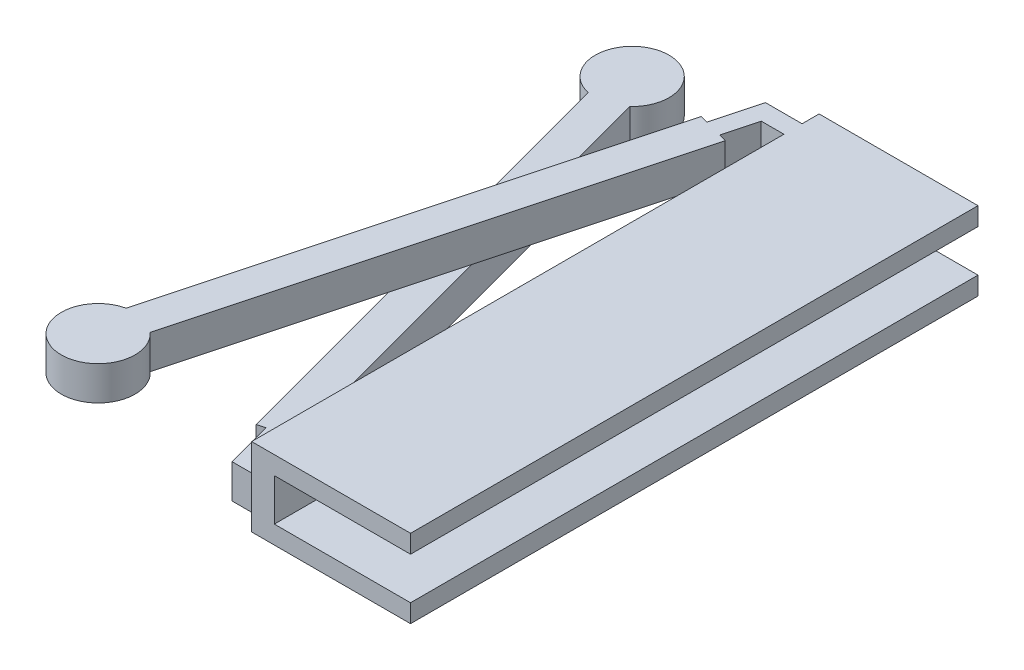
ISO-10303-21;
HEADER;
FILE_DESCRIPTION(('STEP AP214'),'2;1');
FILE_NAME('part.step','',(''),(''),'','','');
FILE_SCHEMA(('AUTOMOTIVE_DESIGN { 1 0 10303 214 1 1 1 1 }'));
ENDSEC;
DATA;
#1=APPLICATION_CONTEXT('core data for automotive mechanical design processes');
#2=APPLICATION_PROTOCOL_DEFINITION('international standard','automotive_design',2000,#1);
#3=PRODUCT_CONTEXT('',#1,'mechanical');
#4=PRODUCT('Part','Part','',(#3));
#5=PRODUCT_RELATED_PRODUCT_CATEGORY('part','',(#4));
#6=PRODUCT_DEFINITION_FORMATION('','',#4);
#7=PRODUCT_DEFINITION_CONTEXT('part definition',#1,'design');
#8=PRODUCT_DEFINITION('design','',#6,#7);
#9=PRODUCT_DEFINITION_SHAPE('','',#8);
#10=(LENGTH_UNIT() NAMED_UNIT(*) SI_UNIT(.MILLI.,.METRE.));
#11=(NAMED_UNIT(*) PLANE_ANGLE_UNIT() SI_UNIT($,.RADIAN.));
#12=(NAMED_UNIT(*) SI_UNIT($,.STERADIAN.) SOLID_ANGLE_UNIT());
#13=UNCERTAINTY_MEASURE_WITH_UNIT(LENGTH_MEASURE(1.E-05),#10,'distance_accuracy_value','');
#14=(GEOMETRIC_REPRESENTATION_CONTEXT(3) GLOBAL_UNCERTAINTY_ASSIGNED_CONTEXT((#13)) GLOBAL_UNIT_ASSIGNED_CONTEXT((#10,
#11,#12)) REPRESENTATION_CONTEXT('',''));
#15=CARTESIAN_POINT('',(0.,0.,0.));
#16=DIRECTION('',(0.,0.,1.));
#17=DIRECTION('',(1.,0.,0.));
#18=AXIS2_PLACEMENT_3D('',#15,#16,#17);
#19=CARTESIAN_POINT('',(0.,0.,50.));
#20=DIRECTION('',(1.,0.,0.));
#21=DIRECTION('',(0.,0.,-1.));
#22=AXIS2_PLACEMENT_3D('',#19,#20,#21);
#23=PLANE('',#22);
#24=DIRECTION('',(0.,0.,-1.));
#25=VECTOR('',#24,1.);
#26=CARTESIAN_POINT('',(0.,3.,50.));
#27=LINE('',#26,#25);
#28=CARTESIAN_POINT('',(0.,3.,48.5));
#29=VERTEX_POINT('',#28);
#30=CARTESIAN_POINT('',(0.,3.,46.9));
#31=VERTEX_POINT('',#30);
#32=EDGE_CURVE('E273',#29,#31,#27,.T.);
#33=ORIENTED_EDGE('',*,*,#32,.F.);
#34=DIRECTION('',(0.,-1.,0.));
#35=VECTOR('',#34,1.);
#36=CARTESIAN_POINT('',(0.,3.,48.5));
#37=LINE('',#36,#35);
#38=CARTESIAN_POINT('',(0.,0.,48.5));
#39=VERTEX_POINT('',#38);
#40=EDGE_CURVE('E319',#29,#39,#37,.T.);
#41=ORIENTED_EDGE('',*,*,#40,.T.);
#42=DIRECTION('',(0.,0.,-1.));
#43=VECTOR('',#42,1.);
#44=CARTESIAN_POINT('',(0.,0.,50.));
#45=LINE('',#44,#43);
#46=CARTESIAN_POINT('',(0.,0.,50.));
#47=VERTEX_POINT('',#46);
#48=EDGE_CURVE('E491',#47,#39,#45,.T.);
#49=ORIENTED_EDGE('',*,*,#48,.F.);
#50=DIRECTION('',(0.,-1.,0.));
#51=VECTOR('',#50,1.);
#52=CARTESIAN_POINT('',(0.,0.,50.));
#53=LINE('',#52,#51);
#54=CARTESIAN_POINT('',(0.,6.90000000000001,50.));
#55=VERTEX_POINT('',#54);
#56=EDGE_CURVE('E462',#55,#47,#53,.T.);
#57=ORIENTED_EDGE('',*,*,#56,.F.);
#58=DIRECTION('',(0.,0.,-1.));
#59=VECTOR('',#58,1.);
#60=CARTESIAN_POINT('',(0.,6.90000000000001,50.));
#61=LINE('',#60,#59);
#62=CARTESIAN_POINT('',(0.,6.90000000000001,3.1));
#63=VERTEX_POINT('',#62);
#64=EDGE_CURVE('E496',#55,#63,#61,.T.);
#65=ORIENTED_EDGE('',*,*,#64,.T.);
#66=DIRECTION('',(0.,1.,0.));
#67=VECTOR('',#66,1.);
#68=CARTESIAN_POINT('',(0.,3.90000000000001,3.1));
#69=LINE('',#68,#67);
#70=CARTESIAN_POINT('',(0.,3.90000000000001,3.1));
#71=VERTEX_POINT('',#70);
#72=EDGE_CURVE('E419',#71,#63,#69,.T.);
#73=ORIENTED_EDGE('',*,*,#72,.F.);
#74=DIRECTION('',(0.,0.,1.));
#75=VECTOR('',#74,1.);
#76=CARTESIAN_POINT('',(0.,3.90000000000001,0.));
#77=LINE('',#76,#75);
#78=CARTESIAN_POINT('',(0.,3.90000000000001,1.5));
#79=VERTEX_POINT('',#78);
#80=EDGE_CURVE('E361',#79,#71,#77,.T.);
#81=ORIENTED_EDGE('',*,*,#80,.F.);
#82=DIRECTION('',(0.,1.,0.));
#83=VECTOR('',#82,1.);
#84=CARTESIAN_POINT('',(0.,3.90000000000001,1.5));
#85=LINE('',#84,#83);
#86=CARTESIAN_POINT('',(0.,6.90000000000001,1.5));
#87=VERTEX_POINT('',#86);
#88=EDGE_CURVE('E416',#79,#87,#85,.T.);
#89=ORIENTED_EDGE('',*,*,#88,.T.);
#90=CARTESIAN_POINT('',(0.,6.90000000000001,0.));
#91=VERTEX_POINT('',#90);
#92=EDGE_CURVE('E495',#87,#91,#61,.T.);
#93=ORIENTED_EDGE('',*,*,#92,.T.);
#94=DIRECTION('',(0.,-1.,0.));
#95=VECTOR('',#94,1.);
#96=CARTESIAN_POINT('',(0.,0.,0.));
#97=LINE('',#96,#95);
#98=CARTESIAN_POINT('',(0.,0.,0.));
#99=VERTEX_POINT('',#98);
#100=EDGE_CURVE('E444',#91,#99,#97,.T.);
#101=ORIENTED_EDGE('',*,*,#100,.T.);
#102=CARTESIAN_POINT('',(0.,0.,46.9));
#103=VERTEX_POINT('',#102);
#104=EDGE_CURVE('E465',#103,#99,#45,.T.);
#105=ORIENTED_EDGE('',*,*,#104,.F.);
#106=DIRECTION('',(0.,-1.,0.));
#107=VECTOR('',#106,1.);
#108=CARTESIAN_POINT('',(0.,3.,46.9));
#109=LINE('',#108,#107);
#110=EDGE_CURVE('E323',#31,#103,#109,.T.);
#111=ORIENTED_EDGE('',*,*,#110,.F.);
#112=EDGE_LOOP('',(#33,#41,#49,#57,#65,#73,#81,#89,#93,#101,#105,#111));
#113=FACE_BOUND('',#112,.T.);
#114=ADVANCED_FACE('F41',(#113),#23,.F.);
#115=CARTESIAN_POINT('',(14.,0.,50.));
#116=DIRECTION('',(0.,1.,0.));
#117=DIRECTION('',(-1.,0.,0.));
#118=AXIS2_PLACEMENT_3D('',#115,#116,#117);
#119=PLANE('',#118);
#120=DIRECTION('',(1.,0.,0.));
#121=VECTOR('',#120,1.);
#122=CARTESIAN_POINT('',(14.,0.,0.));
#123=LINE('',#122,#121);
#124=CARTESIAN_POINT('',(14.,0.,0.));
#125=VERTEX_POINT('',#124);
#126=EDGE_CURVE('E409',#99,#125,#123,.T.);
#127=ORIENTED_EDGE('',*,*,#126,.T.);
#128=DIRECTION('',(0.,0.,-1.));
#129=VECTOR('',#128,1.);
#130=CARTESIAN_POINT('',(14.,0.,50.));
#131=LINE('',#130,#129);
#132=CARTESIAN_POINT('',(14.,0.,50.));
#133=VERTEX_POINT('',#132);
#134=EDGE_CURVE('E11',#133,#125,#131,.T.);
#135=ORIENTED_EDGE('',*,*,#134,.F.);
#136=DIRECTION('',(1.,0.,0.));
#137=VECTOR('',#136,1.);
#138=CARTESIAN_POINT('',(14.,0.,50.));
#139=LINE('',#138,#137);
#140=EDGE_CURVE('E439',#47,#133,#139,.T.);
#141=ORIENTED_EDGE('',*,*,#140,.F.);
#142=ORIENTED_EDGE('',*,*,#48,.T.);
#143=DIRECTION('',(-1.,0.,0.));
#144=VECTOR('',#143,1.);
#145=CARTESIAN_POINT('',(0.,0.,48.5));
#146=LINE('',#145,#144);
#147=CARTESIAN_POINT('',(-3.22772318076634,0.,48.5));
#148=VERTEX_POINT('',#147);
#149=EDGE_CURVE('E303',#39,#148,#146,.T.);
#150=ORIENTED_EDGE('',*,*,#149,.T.);
#151=DIRECTION('',(-0.258819045102517,0.,-0.965925826289069));
#152=VECTOR('',#151,1.);
#153=CARTESIAN_POINT('',(-2.63650672584696,0.,50.7064498480299));
#154=LINE('',#153,#152);
#155=CARTESIAN_POINT('',(-4.32193845737006,0.,44.4163329932968));
#156=VERTEX_POINT('',#155);
#157=EDGE_CURVE('E259',#148,#156,#154,.T.);
#158=ORIENTED_EDGE('',*,*,#157,.T.);
#159=DIRECTION('',(-0.96592582628907,0.,0.258819045102517));
#160=VECTOR('',#159,1.);
#161=CARTESIAN_POINT('',(-1.6854317315231,0.,43.7098831452669));
#162=LINE('',#161,#160);
#163=CARTESIAN_POINT('',(-4.99808653577242,0.,44.5975063248686));
#164=VERTEX_POINT('',#163);
#165=EDGE_CURVE('E255',#156,#164,#162,.T.);
#166=ORIENTED_EDGE('',*,*,#165,.T.);
#167=DIRECTION('',(-0.258819045102517,0.,-0.96592582628907));
#168=VECTOR('',#167,1.);
#169=CARTESIAN_POINT('',(-3.31265480424932,0.,50.8876231796017));
#170=LINE('',#169,#168);
#171=CARTESIAN_POINT('',(-15.7026770298492,0.,4.6474307267546));
#172=VERTEX_POINT('',#171);
#173=EDGE_CURVE('E286',#164,#172,#170,.T.);
#174=ORIENTED_EDGE('',*,*,#173,.T.);
#175=CARTESIAN_POINT('',(-15.,0.,1.47430214572886));
#176=DIRECTION('',(0.,-1.,0.));
#177=DIRECTION('',(-1.,0.,0.));
#178=AXIS2_PLACEMENT_3D('',#175,#176,#177);
#179=CIRCLE('',#178,3.25000000000001);
#180=CARTESIAN_POINT('',(-12.804899550982,0.,3.87097359144704));
#181=VERTEX_POINT('',#180);
#182=EDGE_CURVE('E232',#172,#181,#179,.T.);
#183=ORIENTED_EDGE('',*,*,#182,.T.);
#184=DIRECTION('',(-0.258819045102517,0.,-0.965925826289069));
#185=VECTOR('',#184,1.);
#186=CARTESIAN_POINT('',(-0.414877325382092,0.,50.1111660442941));
#187=LINE('',#186,#185);
#188=CARTESIAN_POINT('',(-2.10030905690519,0.,43.821049189561));
#189=VERTEX_POINT('',#188);
#190=EDGE_CURVE('E291',#189,#181,#187,.T.);
#191=ORIENTED_EDGE('',*,*,#190,.F.);
#192=DIRECTION('',(0.96592582628907,0.,-0.258819045102513));
#193=VECTOR('',#192,1.);
#194=CARTESIAN_POINT('',(-1.68543173152307,0.,43.7098831452669));
#195=LINE('',#194,#193);
#196=CARTESIAN_POINT('',(-2.77645713530754,0.,44.0022225211328));
#197=VERTEX_POINT('',#196);
#198=EDGE_CURVE('E295',#197,#189,#195,.T.);
#199=ORIENTED_EDGE('',*,*,#198,.F.);
#200=DIRECTION('',(-0.258819045102516,0.,-0.96592582628907));
#201=VECTOR('',#200,1.);
#202=CARTESIAN_POINT('',(-1.09102540378445,0.,50.2923393758659));
#203=LINE('',#202,#201);
#204=CARTESIAN_POINT('',(-1.99999999999999,0.,46.9));
#205=VERTEX_POINT('',#204);
#206=EDGE_CURVE('E298',#205,#197,#203,.T.);
#207=ORIENTED_EDGE('',*,*,#206,.F.);
#208=DIRECTION('',(-1.,0.,0.));
#209=VECTOR('',#208,1.);
#210=CARTESIAN_POINT('',(0.,0.,46.9));
#211=LINE('',#210,#209);
#212=EDGE_CURVE('E57',#103,#205,#211,.T.);
#213=ORIENTED_EDGE('',*,*,#212,.F.);
#214=ORIENTED_EDGE('',*,*,#104,.T.);
#215=EDGE_LOOP('',(#127,#135,#141,#142,#150,#158,#166,#174,#183,#191,#199,#207,#213,#214));
#216=FACE_BOUND('',#215,.T.);
#217=ADVANCED_FACE('F43',(#216),#119,.F.);
#218=CARTESIAN_POINT('',(14.,1.6,50.));
#219=DIRECTION('',(-1.,0.,0.));
#220=DIRECTION('',(0.,0.,1.));
#221=AXIS2_PLACEMENT_3D('',#218,#219,#220);
#222=PLANE('',#221);
#223=DIRECTION('',(0.,1.,0.));
#224=VECTOR('',#223,1.);
#225=CARTESIAN_POINT('',(14.,1.6,0.));
#226=LINE('',#225,#224);
#227=CARTESIAN_POINT('',(14.,1.6,0.));
#228=VERTEX_POINT('',#227);
#229=EDGE_CURVE('E469',#125,#228,#226,.T.);
#230=ORIENTED_EDGE('',*,*,#229,.T.);
#231=DIRECTION('',(0.,0.,-1.));
#232=VECTOR('',#231,1.);
#233=CARTESIAN_POINT('',(14.,1.6,50.));
#234=LINE('',#233,#232);
#235=CARTESIAN_POINT('',(14.,1.6,50.));
#236=VERTEX_POINT('',#235);
#237=EDGE_CURVE('E50',#236,#228,#234,.T.);
#238=ORIENTED_EDGE('',*,*,#237,.F.);
#239=DIRECTION('',(0.,1.,0.));
#240=VECTOR('',#239,1.);
#241=CARTESIAN_POINT('',(14.,1.6,50.));
#242=LINE('',#241,#240);
#243=EDGE_CURVE('E443',#133,#236,#242,.T.);
#244=ORIENTED_EDGE('',*,*,#243,.F.);
#245=ORIENTED_EDGE('',*,*,#134,.T.);
#246=EDGE_LOOP('',(#230,#238,#244,#245));
#247=FACE_BOUND('',#246,.T.);
#248=ADVANCED_FACE('F544',(#247),#222,.F.);
#249=CARTESIAN_POINT('',(2.,1.6,50.));
#250=DIRECTION('',(0.,-1.,0.));
#251=DIRECTION('',(0.,0.,-1.));
#252=AXIS2_PLACEMENT_3D('',#249,#250,#251);
#253=PLANE('',#252);
#254=DIRECTION('',(-1.,0.,0.));
#255=VECTOR('',#254,1.);
#256=CARTESIAN_POINT('',(2.,1.6,0.));
#257=LINE('',#256,#255);
#258=CARTESIAN_POINT('',(2.,1.6,0.));
#259=VERTEX_POINT('',#258);
#260=EDGE_CURVE('E472',#228,#259,#257,.T.);
#261=ORIENTED_EDGE('',*,*,#260,.T.);
#262=DIRECTION('',(0.,0.,-1.));
#263=VECTOR('',#262,1.);
#264=CARTESIAN_POINT('',(2.,1.6,50.));
#265=LINE('',#264,#263);
#266=CARTESIAN_POINT('',(2.,1.6,50.));
#267=VERTEX_POINT('',#266);
#268=EDGE_CURVE('E512',#267,#259,#265,.T.);
#269=ORIENTED_EDGE('',*,*,#268,.F.);
#270=DIRECTION('',(-1.,0.,0.));
#271=VECTOR('',#270,1.);
#272=CARTESIAN_POINT('',(2.,1.6,50.));
#273=LINE('',#272,#271);
#274=EDGE_CURVE('E447',#236,#267,#273,.T.);
#275=ORIENTED_EDGE('',*,*,#274,.F.);
#276=ORIENTED_EDGE('',*,*,#237,.T.);
#277=EDGE_LOOP('',(#261,#269,#275,#276));
#278=FACE_BOUND('',#277,.T.);
#279=ADVANCED_FACE('F521',(#278),#253,.F.);
#280=CARTESIAN_POINT('',(2.,5.29999999999999,50.));
#281=DIRECTION('',(-1.,0.,0.));
#282=DIRECTION('',(0.,-1.,0.));
#283=AXIS2_PLACEMENT_3D('',#280,#281,#282);
#284=PLANE('',#283);
#285=DIRECTION('',(0.,1.,0.));
#286=VECTOR('',#285,1.);
#287=CARTESIAN_POINT('',(2.,5.29999999999999,0.));
#288=LINE('',#287,#286);
#289=CARTESIAN_POINT('',(2.,5.29999999999999,0.));
#290=VERTEX_POINT('',#289);
#291=EDGE_CURVE('E475',#259,#290,#288,.T.);
#292=ORIENTED_EDGE('',*,*,#291,.T.);
#293=DIRECTION('',(0.,0.,-1.));
#294=VECTOR('',#293,1.);
#295=CARTESIAN_POINT('',(2.,5.29999999999999,50.));
#296=LINE('',#295,#294);
#297=CARTESIAN_POINT('',(2.,5.29999999999999,50.));
#298=VERTEX_POINT('',#297);
#299=EDGE_CURVE('E508',#298,#290,#296,.T.);
#300=ORIENTED_EDGE('',*,*,#299,.F.);
#301=DIRECTION('',(0.,1.,0.));
#302=VECTOR('',#301,1.);
#303=CARTESIAN_POINT('',(2.,5.29999999999999,50.));
#304=LINE('',#303,#302);
#305=EDGE_CURVE('E450',#267,#298,#304,.T.);
#306=ORIENTED_EDGE('',*,*,#305,.F.);
#307=ORIENTED_EDGE('',*,*,#268,.T.);
#308=EDGE_LOOP('',(#292,#300,#306,#307));
#309=FACE_BOUND('',#308,.T.);
#310=ADVANCED_FACE('F532',(#309),#284,.F.);
#311=CARTESIAN_POINT('',(14.,5.30000000000001,50.));
#312=DIRECTION('',(0.,1.,0.));
#313=DIRECTION('',(-1.,0.,0.));
#314=AXIS2_PLACEMENT_3D('',#311,#312,#313);
#315=PLANE('',#314);
#316=DIRECTION('',(1.,0.,0.));
#317=VECTOR('',#316,1.);
#318=CARTESIAN_POINT('',(14.,5.30000000000001,0.));
#319=LINE('',#318,#317);
#320=CARTESIAN_POINT('',(14.,5.30000000000001,0.));
#321=VERTEX_POINT('',#320);
#322=EDGE_CURVE('E478',#290,#321,#319,.T.);
#323=ORIENTED_EDGE('',*,*,#322,.T.);
#324=DIRECTION('',(0.,0.,-1.));
#325=VECTOR('',#324,1.);
#326=CARTESIAN_POINT('',(14.,5.30000000000001,50.));
#327=LINE('',#326,#325);
#328=CARTESIAN_POINT('',(14.,5.30000000000001,50.));
#329=VERTEX_POINT('',#328);
#330=EDGE_CURVE('E504',#329,#321,#327,.T.);
#331=ORIENTED_EDGE('',*,*,#330,.F.);
#332=DIRECTION('',(1.,0.,0.));
#333=VECTOR('',#332,1.);
#334=CARTESIAN_POINT('',(14.,5.30000000000001,50.));
#335=LINE('',#334,#333);
#336=EDGE_CURVE('E453',#298,#329,#335,.T.);
#337=ORIENTED_EDGE('',*,*,#336,.F.);
#338=ORIENTED_EDGE('',*,*,#299,.T.);
#339=EDGE_LOOP('',(#323,#331,#337,#338));
#340=FACE_BOUND('',#339,.T.);
#341=ADVANCED_FACE('F536',(#340),#315,.F.);
#342=CARTESIAN_POINT('',(14.,6.90000000000001,50.));
#343=DIRECTION('',(-1.,0.,0.));
#344=DIRECTION('',(0.,0.,1.));
#345=AXIS2_PLACEMENT_3D('',#342,#343,#344);
#346=PLANE('',#345);
#347=DIRECTION('',(0.,1.,0.));
#348=VECTOR('',#347,1.);
#349=CARTESIAN_POINT('',(14.,6.90000000000001,0.));
#350=LINE('',#349,#348);
#351=CARTESIAN_POINT('',(14.,6.90000000000001,0.));
#352=VERTEX_POINT('',#351);
#353=EDGE_CURVE('E481',#321,#352,#350,.T.);
#354=ORIENTED_EDGE('',*,*,#353,.T.);
#355=DIRECTION('',(0.,0.,-1.));
#356=VECTOR('',#355,1.);
#357=CARTESIAN_POINT('',(14.,6.90000000000001,50.));
#358=LINE('',#357,#356);
#359=CARTESIAN_POINT('',(14.,6.90000000000001,50.));
#360=VERTEX_POINT('',#359);
#361=EDGE_CURVE('E500',#360,#352,#358,.T.);
#362=ORIENTED_EDGE('',*,*,#361,.F.);
#363=DIRECTION('',(0.,1.,0.));
#364=VECTOR('',#363,1.);
#365=CARTESIAN_POINT('',(14.,6.90000000000001,50.));
#366=LINE('',#365,#364);
#367=EDGE_CURVE('E456',#329,#360,#366,.T.);
#368=ORIENTED_EDGE('',*,*,#367,.F.);
#369=ORIENTED_EDGE('',*,*,#330,.T.);
#370=EDGE_LOOP('',(#354,#362,#368,#369));
#371=FACE_BOUND('',#370,.T.);
#372=ADVANCED_FACE('F559',(#371),#346,.F.);
#373=CARTESIAN_POINT('',(0.,6.90000000000001,50.));
#374=DIRECTION('',(0.,-1.,0.));
#375=DIRECTION('',(0.,0.,-1.));
#376=AXIS2_PLACEMENT_3D('',#373,#374,#375);
#377=PLANE('',#376);
#378=DIRECTION('',(-1.,0.,0.));
#379=VECTOR('',#378,1.);
#380=CARTESIAN_POINT('',(0.,6.90000000000001,0.));
#381=LINE('',#380,#379);
#382=EDGE_CURVE('E484',#352,#91,#381,.T.);
#383=ORIENTED_EDGE('',*,*,#382,.T.);
#384=ORIENTED_EDGE('',*,*,#92,.F.);
#385=DIRECTION('',(-1.,0.,0.));
#386=VECTOR('',#385,1.);
#387=CARTESIAN_POINT('',(0.,6.90000000000001,1.5));
#388=LINE('',#387,#386);
#389=CARTESIAN_POINT('',(-3.22772318076634,6.9,1.5));
#390=VERTEX_POINT('',#389);
#391=EDGE_CURVE('E65',#87,#390,#388,.T.);
#392=ORIENTED_EDGE('',*,*,#391,.T.);
#393=DIRECTION('',(-0.258819045102517,0.,0.965925826289069));
#394=VECTOR('',#393,1.);
#395=CARTESIAN_POINT('',(-2.63650672584696,6.9,-0.706449848029905));
#396=LINE('',#395,#394);
#397=CARTESIAN_POINT('',(-4.32193845737006,6.9,5.58366700670318));
#398=VERTEX_POINT('',#397);
#399=EDGE_CURVE('E399',#390,#398,#396,.T.);
#400=ORIENTED_EDGE('',*,*,#399,.T.);
#401=DIRECTION('',(-0.96592582628907,0.,-0.258819045102517));
#402=VECTOR('',#401,1.);
#403=CARTESIAN_POINT('',(-1.6854317315231,6.9,6.29011685473309));
#404=LINE('',#403,#402);
#405=CARTESIAN_POINT('',(-4.99808653577242,6.9,5.40249367513142));
#406=VERTEX_POINT('',#405);
#407=EDGE_CURVE('E345',#398,#406,#404,.T.);
#408=ORIENTED_EDGE('',*,*,#407,.T.);
#409=DIRECTION('',(-0.258819045102517,0.,0.96592582628907));
#410=VECTOR('',#409,1.);
#411=CARTESIAN_POINT('',(-3.31265480424933,6.9,-0.887623179601669));
#412=LINE('',#411,#410);
#413=CARTESIAN_POINT('',(-15.7026770298492,6.9,45.3525692732454));
#414=VERTEX_POINT('',#413);
#415=EDGE_CURVE('E312',#406,#414,#412,.T.);
#416=ORIENTED_EDGE('',*,*,#415,.T.);
#417=CARTESIAN_POINT('',(-15.,6.9,48.5256978542711));
#418=DIRECTION('',(0.,1.,0.));
#419=DIRECTION('',(-1.,0.,0.));
#420=AXIS2_PLACEMENT_3D('',#417,#418,#419);
#421=CIRCLE('',#420,3.25000000000001);
#422=CARTESIAN_POINT('',(-12.804899550982,6.9,46.129026408553));
#423=VERTEX_POINT('',#422);
#424=EDGE_CURVE('E380',#414,#423,#421,.T.);
#425=ORIENTED_EDGE('',*,*,#424,.T.);
#426=DIRECTION('',(-0.258819045102517,0.,0.965925826289069));
#427=VECTOR('',#426,1.);
#428=CARTESIAN_POINT('',(-0.414877325382095,6.90000000000001,-0.111166044294113));
#429=LINE('',#428,#427);
#430=CARTESIAN_POINT('',(-2.10030905690519,6.9,6.17895081043897));
#431=VERTEX_POINT('',#430);
#432=EDGE_CURVE('E384',#431,#423,#429,.T.);
#433=ORIENTED_EDGE('',*,*,#432,.F.);
#434=DIRECTION('',(0.96592582628907,0.,0.258819045102513));
#435=VECTOR('',#434,1.);
#436=CARTESIAN_POINT('',(-1.68543173152308,6.9,6.29011685473309));
#437=LINE('',#436,#435);
#438=CARTESIAN_POINT('',(-2.77645713530754,6.9,5.99777747886721));
#439=VERTEX_POINT('',#438);
#440=EDGE_CURVE('E388',#439,#431,#437,.T.);
#441=ORIENTED_EDGE('',*,*,#440,.F.);
#442=DIRECTION('',(-0.258819045102516,0.,0.96592582628907));
#443=VECTOR('',#442,1.);
#444=CARTESIAN_POINT('',(-1.09102540378445,6.9,-0.292339375865877));
#445=LINE('',#444,#443);
#446=CARTESIAN_POINT('',(-2.,6.9,3.1));
#447=VERTEX_POINT('',#446);
#448=EDGE_CURVE('E391',#447,#439,#445,.T.);
#449=ORIENTED_EDGE('',*,*,#448,.F.);
#450=DIRECTION('',(-1.,0.,0.));
#451=VECTOR('',#450,1.);
#452=CARTESIAN_POINT('',(0.,6.90000000000001,3.1));
#453=LINE('',#452,#451);
#454=EDGE_CURVE('E394',#63,#447,#453,.T.);
#455=ORIENTED_EDGE('',*,*,#454,.F.);
#456=ORIENTED_EDGE('',*,*,#64,.F.);
#457=DIRECTION('',(-1.,0.,0.));
#458=VECTOR('',#457,1.);
#459=CARTESIAN_POINT('',(0.,6.90000000000001,50.));
#460=LINE('',#459,#458);
#461=EDGE_CURVE('E459',#360,#55,#460,.T.);
#462=ORIENTED_EDGE('',*,*,#461,.F.);
#463=ORIENTED_EDGE('',*,*,#361,.T.);
#464=EDGE_LOOP('',(#383,#384,#392,#400,#408,#416,#425,#433,#441,#449,#455,#456,#462,#463));
#465=FACE_BOUND('',#464,.T.);
#466=ADVANCED_FACE('F555',(#465),#377,.F.);
#467=CARTESIAN_POINT('',(0.,0.,50.));
#468=DIRECTION('',(0.,0.,-1.));
#469=DIRECTION('',(-1.,0.,0.));
#470=AXIS2_PLACEMENT_3D('',#467,#468,#469);
#471=PLANE('',#470);
#472=ORIENTED_EDGE('',*,*,#140,.T.);
#473=ORIENTED_EDGE('',*,*,#243,.T.);
#474=ORIENTED_EDGE('',*,*,#274,.T.);
#475=ORIENTED_EDGE('',*,*,#305,.T.);
#476=ORIENTED_EDGE('',*,*,#336,.T.);
#477=ORIENTED_EDGE('',*,*,#367,.T.);
#478=ORIENTED_EDGE('',*,*,#461,.T.);
#479=ORIENTED_EDGE('',*,*,#56,.T.);
#480=EDGE_LOOP('',(#472,#473,#474,#475,#476,#477,#478,#479));
#481=FACE_BOUND('',#480,.T.);
#482=ADVANCED_FACE('F540',(#481),#471,.F.);
#483=CARTESIAN_POINT('',(0.,0.,0.));
#484=DIRECTION('',(0.,0.,-1.));
#485=DIRECTION('',(-1.,0.,0.));
#486=AXIS2_PLACEMENT_3D('',#483,#484,#485);
#487=PLANE('',#486);
#488=ORIENTED_EDGE('',*,*,#126,.F.);
#489=ORIENTED_EDGE('',*,*,#100,.F.);
#490=ORIENTED_EDGE('',*,*,#382,.F.);
#491=ORIENTED_EDGE('',*,*,#353,.F.);
#492=ORIENTED_EDGE('',*,*,#322,.F.);
#493=ORIENTED_EDGE('',*,*,#291,.F.);
#494=ORIENTED_EDGE('',*,*,#260,.F.);
#495=ORIENTED_EDGE('',*,*,#229,.F.);
#496=EDGE_LOOP('',(#488,#489,#490,#491,#492,#493,#494,#495));
#497=FACE_BOUND('',#496,.T.);
#498=ADVANCED_FACE('F527',(#497),#487,.T.);
#499=CARTESIAN_POINT('',(-3.31265480424932,3.9,-0.887623179601669));
#500=DIRECTION('',(-0.965925826289069,0.,-0.258819045102517));
#501=DIRECTION('',(-0.258819045102517,0.,0.96592582628907));
#502=AXIS2_PLACEMENT_3D('',#499,#500,#501);
#503=PLANE('',#502);
#504=ORIENTED_EDGE('',*,*,#415,.F.);
#505=DIRECTION('',(0.,1.,0.));
#506=VECTOR('',#505,1.);
#507=CARTESIAN_POINT('',(-4.99808653577242,3.9,5.40249367513142));
#508=LINE('',#507,#506);
#509=CARTESIAN_POINT('',(-4.99808653577242,3.9,5.40249367513142));
#510=VERTEX_POINT('',#509);
#511=EDGE_CURVE('E406',#510,#406,#508,.T.);
#512=ORIENTED_EDGE('',*,*,#511,.F.);
#513=DIRECTION('',(-0.258819045102517,0.,0.96592582628907));
#514=VECTOR('',#513,1.);
#515=CARTESIAN_POINT('',(-3.31265480424932,3.9,-0.887623179601669));
#516=LINE('',#515,#514);
#517=CARTESIAN_POINT('',(-15.7026770298492,3.9,45.3525692732454));
#518=VERTEX_POINT('',#517);
#519=EDGE_CURVE('E340',#510,#518,#516,.T.);
#520=ORIENTED_EDGE('',*,*,#519,.T.);
#521=DIRECTION('',(0.,1.,0.));
#522=VECTOR('',#521,1.);
#523=CARTESIAN_POINT('',(-15.7026770298492,3.9,45.3525692732454));
#524=LINE('',#523,#522);
#525=EDGE_CURVE('E376',#518,#414,#524,.T.);
#526=ORIENTED_EDGE('',*,*,#525,.T.);
#527=EDGE_LOOP('',(#504,#512,#520,#526));
#528=FACE_BOUND('',#527,.T.);
#529=ADVANCED_FACE('F576',(#528),#503,.T.);
#530=CARTESIAN_POINT('',(-1.6854317315231,3.90000000000001,6.29011685473309));
#531=DIRECTION('',(0.258819045102517,0.,-0.965925826289069));
#532=DIRECTION('',(-0.96592582628907,0.,-0.258819045102517));
#533=AXIS2_PLACEMENT_3D('',#530,#531,#532);
#534=PLANE('',#533);
#535=ORIENTED_EDGE('',*,*,#407,.F.);
#536=DIRECTION('',(0.,1.,0.));
#537=VECTOR('',#536,1.);
#538=CARTESIAN_POINT('',(-4.32193845737006,3.9,5.58366700670318));
#539=LINE('',#538,#537);
#540=CARTESIAN_POINT('',(-4.32193845737006,3.9,5.58366700670318));
#541=VERTEX_POINT('',#540);
#542=EDGE_CURVE('E410',#541,#398,#539,.T.);
#543=ORIENTED_EDGE('',*,*,#542,.F.);
#544=DIRECTION('',(-0.96592582628907,0.,-0.258819045102517));
#545=VECTOR('',#544,1.);
#546=CARTESIAN_POINT('',(-1.6854317315231,3.90000000000001,6.29011685473309));
#547=LINE('',#546,#545);
#548=EDGE_CURVE('E372',#541,#510,#547,.T.);
#549=ORIENTED_EDGE('',*,*,#548,.T.);
#550=ORIENTED_EDGE('',*,*,#511,.T.);
#551=EDGE_LOOP('',(#535,#543,#549,#550));
#552=FACE_BOUND('',#551,.T.);
#553=ADVANCED_FACE('F581',(#552),#534,.T.);
#554=CARTESIAN_POINT('',(-2.63650672584696,3.9,-0.706449848029905));
#555=DIRECTION('',(-0.965925826289069,0.,-0.258819045102517));
#556=DIRECTION('',(-0.258819045102517,0.,0.965925826289069));
#557=AXIS2_PLACEMENT_3D('',#554,#555,#556);
#558=PLANE('',#557);
#559=ORIENTED_EDGE('',*,*,#399,.F.);
#560=DIRECTION('',(0.,1.,0.));
#561=VECTOR('',#560,1.);
#562=CARTESIAN_POINT('',(-3.22772318076634,3.9,1.5));
#563=LINE('',#562,#561);
#564=CARTESIAN_POINT('',(-3.22772318076634,3.9,1.5));
#565=VERTEX_POINT('',#564);
#566=EDGE_CURVE('E413',#565,#390,#563,.T.);
#567=ORIENTED_EDGE('',*,*,#566,.F.);
#568=DIRECTION('',(-0.258819045102517,0.,0.965925826289069));
#569=VECTOR('',#568,1.);
#570=CARTESIAN_POINT('',(-2.63650672584696,3.9,-0.706449848029905));
#571=LINE('',#570,#569);
#572=EDGE_CURVE('E368',#565,#541,#571,.T.);
#573=ORIENTED_EDGE('',*,*,#572,.T.);
#574=ORIENTED_EDGE('',*,*,#542,.T.);
#575=EDGE_LOOP('',(#559,#567,#573,#574));
#576=FACE_BOUND('',#575,.T.);
#577=ADVANCED_FACE('F607',(#576),#558,.T.);
#578=CARTESIAN_POINT('',(0.,3.90000000000001,1.5));
#579=DIRECTION('',(0.,0.,-1.));
#580=DIRECTION('',(-1.,0.,0.));
#581=AXIS2_PLACEMENT_3D('',#578,#579,#580);
#582=PLANE('',#581);
#583=ORIENTED_EDGE('',*,*,#391,.F.);
#584=ORIENTED_EDGE('',*,*,#88,.F.);
#585=DIRECTION('',(-1.,0.,0.));
#586=VECTOR('',#585,1.);
#587=CARTESIAN_POINT('',(0.,3.90000000000001,1.5));
#588=LINE('',#587,#586);
#589=EDGE_CURVE('E364',#79,#565,#588,.T.);
#590=ORIENTED_EDGE('',*,*,#589,.T.);
#591=ORIENTED_EDGE('',*,*,#566,.T.);
#592=EDGE_LOOP('',(#583,#584,#590,#591));
#593=FACE_BOUND('',#592,.T.);
#594=ADVANCED_FACE('F603',(#593),#582,.T.);
#595=CARTESIAN_POINT('',(0.,3.90000000000001,3.1));
#596=DIRECTION('',(0.,0.,-1.));
#597=DIRECTION('',(-1.,0.,0.));
#598=AXIS2_PLACEMENT_3D('',#595,#596,#597);
#599=PLANE('',#598);
#600=ORIENTED_EDGE('',*,*,#454,.T.);
#601=DIRECTION('',(0.,1.,0.));
#602=VECTOR('',#601,1.);
#603=CARTESIAN_POINT('',(-1.99999999999999,3.90000000000001,3.1));
#604=LINE('',#603,#602);
#605=CARTESIAN_POINT('',(-1.99999999999999,3.90000000000001,3.1));
#606=VERTEX_POINT('',#605);
#607=EDGE_CURVE('E422',#606,#447,#604,.T.);
#608=ORIENTED_EDGE('',*,*,#607,.F.);
#609=DIRECTION('',(-1.,0.,0.));
#610=VECTOR('',#609,1.);
#611=CARTESIAN_POINT('',(0.,3.90000000000001,3.1));
#612=LINE('',#611,#610);
#613=EDGE_CURVE('E358',#71,#606,#612,.T.);
#614=ORIENTED_EDGE('',*,*,#613,.F.);
#615=ORIENTED_EDGE('',*,*,#72,.T.);
#616=EDGE_LOOP('',(#600,#608,#614,#615));
#617=FACE_BOUND('',#616,.T.);
#618=ADVANCED_FACE('F599',(#617),#599,.F.);
#619=CARTESIAN_POINT('',(-1.09102540378445,3.90000000000001,-0.292339375865877));
#620=DIRECTION('',(-0.965925826289069,0.,-0.258819045102516));
#621=DIRECTION('',(-0.258819045102516,0.,0.96592582628907));
#622=AXIS2_PLACEMENT_3D('',#619,#620,#621);
#623=PLANE('',#622);
#624=ORIENTED_EDGE('',*,*,#448,.T.);
#625=DIRECTION('',(0.,1.,0.));
#626=VECTOR('',#625,1.);
#627=CARTESIAN_POINT('',(-2.77645713530754,3.9,5.99777747886721));
#628=LINE('',#627,#626);
#629=CARTESIAN_POINT('',(-2.77645713530754,3.9,5.99777747886721));
#630=VERTEX_POINT('',#629);
#631=EDGE_CURVE('E426',#630,#439,#628,.T.);
#632=ORIENTED_EDGE('',*,*,#631,.F.);
#633=DIRECTION('',(-0.258819045102516,0.,0.96592582628907));
#634=VECTOR('',#633,1.);
#635=CARTESIAN_POINT('',(-1.09102540378445,3.90000000000001,-0.292339375865877));
#636=LINE('',#635,#634);
#637=EDGE_CURVE('E355',#606,#630,#636,.T.);
#638=ORIENTED_EDGE('',*,*,#637,.F.);
#639=ORIENTED_EDGE('',*,*,#607,.T.);
#640=EDGE_LOOP('',(#624,#632,#638,#639));
#641=FACE_BOUND('',#640,.T.);
#642=ADVANCED_FACE('F595',(#641),#623,.F.);
#643=CARTESIAN_POINT('',(-1.68543173152307,3.90000000000001,6.29011685473309));
#644=DIRECTION('',(-0.258819045102513,0.,0.96592582628907));
#645=DIRECTION('',(0.96592582628907,0.,0.258819045102513));
#646=AXIS2_PLACEMENT_3D('',#643,#644,#645);
#647=PLANE('',#646);
#648=ORIENTED_EDGE('',*,*,#440,.T.);
#649=DIRECTION('',(0.,1.,0.));
#650=VECTOR('',#649,1.);
#651=CARTESIAN_POINT('',(-2.10030905690519,3.90000000000001,6.17895081043897));
#652=LINE('',#651,#650);
#653=CARTESIAN_POINT('',(-2.10030905690519,3.90000000000001,6.17895081043897));
#654=VERTEX_POINT('',#653);
#655=EDGE_CURVE('E430',#654,#431,#652,.T.);
#656=ORIENTED_EDGE('',*,*,#655,.F.);
#657=DIRECTION('',(0.96592582628907,0.,0.258819045102513));
#658=VECTOR('',#657,1.);
#659=CARTESIAN_POINT('',(-1.68543173152307,3.90000000000001,6.29011685473309));
#660=LINE('',#659,#658);
#661=EDGE_CURVE('E352',#630,#654,#660,.T.);
#662=ORIENTED_EDGE('',*,*,#661,.F.);
#663=ORIENTED_EDGE('',*,*,#631,.T.);
#664=EDGE_LOOP('',(#648,#656,#662,#663));
#665=FACE_BOUND('',#664,.T.);
#666=ADVANCED_FACE('F591',(#665),#647,.F.);
#667=CARTESIAN_POINT('',(-0.414877325382093,3.90000000000001,-0.111166044294113));
#668=DIRECTION('',(-0.965925826289069,0.,-0.258819045102517));
#669=DIRECTION('',(-0.258819045102517,0.,0.965925826289069));
#670=AXIS2_PLACEMENT_3D('',#667,#668,#669);
#671=PLANE('',#670);
#672=ORIENTED_EDGE('',*,*,#432,.T.);
#673=DIRECTION('',(0.,1.,0.));
#674=VECTOR('',#673,1.);
#675=CARTESIAN_POINT('',(-12.804899550982,3.9,46.129026408553));
#676=LINE('',#675,#674);
#677=CARTESIAN_POINT('',(-12.804899550982,3.9,46.129026408553));
#678=VERTEX_POINT('',#677);
#679=EDGE_CURVE('E434',#678,#423,#676,.T.);
#680=ORIENTED_EDGE('',*,*,#679,.F.);
#681=DIRECTION('',(-0.258819045102517,0.,0.965925826289069));
#682=VECTOR('',#681,1.);
#683=CARTESIAN_POINT('',(-0.414877325382093,3.90000000000001,-0.111166044294113));
#684=LINE('',#683,#682);
#685=EDGE_CURVE('E349',#654,#678,#684,.T.);
#686=ORIENTED_EDGE('',*,*,#685,.F.);
#687=ORIENTED_EDGE('',*,*,#655,.T.);
#688=EDGE_LOOP('',(#672,#680,#686,#687));
#689=FACE_BOUND('',#688,.T.);
#690=ADVANCED_FACE('F587',(#689),#671,.F.);
#691=CARTESIAN_POINT('',(-15.,3.9,48.5256978542711));
#692=DIRECTION('',(0.,1.,0.));
#693=DIRECTION('',(-1.,0.,0.));
#694=AXIS2_PLACEMENT_3D('',#691,#692,#693);
#695=CYLINDRICAL_SURFACE('',#694,3.25000000000001);
#696=ORIENTED_EDGE('',*,*,#424,.F.);
#697=ORIENTED_EDGE('',*,*,#525,.F.);
#698=CARTESIAN_POINT('',(-15.,3.9,48.5256978542711));
#699=DIRECTION('',(0.,1.,0.));
#700=DIRECTION('',(-1.,0.,0.));
#701=AXIS2_PLACEMENT_3D('',#698,#699,#700);
#702=CIRCLE('',#701,3.25000000000001);
#703=EDGE_CURVE('E344',#518,#678,#702,.T.);
#704=ORIENTED_EDGE('',*,*,#703,.T.);
#705=ORIENTED_EDGE('',*,*,#679,.T.);
#706=EDGE_LOOP('',(#696,#697,#704,#705));
#707=FACE_BOUND('',#706,.T.);
#708=ADVANCED_FACE('F583',(#707),#695,.T.);
#709=CARTESIAN_POINT('',(0.,3.90000000000001,0.));
#710=DIRECTION('',(0.,1.,0.));
#711=DIRECTION('',(-1.,0.,0.));
#712=AXIS2_PLACEMENT_3D('',#709,#710,#711);
#713=PLANE('',#712);
#714=ORIENTED_EDGE('',*,*,#519,.F.);
#715=ORIENTED_EDGE('',*,*,#548,.F.);
#716=ORIENTED_EDGE('',*,*,#572,.F.);
#717=ORIENTED_EDGE('',*,*,#589,.F.);
#718=ORIENTED_EDGE('',*,*,#80,.T.);
#719=ORIENTED_EDGE('',*,*,#613,.T.);
#720=ORIENTED_EDGE('',*,*,#637,.T.);
#721=ORIENTED_EDGE('',*,*,#661,.T.);
#722=ORIENTED_EDGE('',*,*,#685,.T.);
#723=ORIENTED_EDGE('',*,*,#703,.F.);
#724=EDGE_LOOP('',(#714,#715,#716,#717,#718,#719,#720,#721,#722,#723));
#725=FACE_BOUND('',#724,.T.);
#726=ADVANCED_FACE('F586',(#725),#713,.F.);
#727=CARTESIAN_POINT('',(-3.31265480424932,3.,50.8876231796017));
#728=DIRECTION('',(-0.965925826289069,0.,0.258819045102517));
#729=DIRECTION('',(0.258819045102517,0.,0.96592582628907));
#730=AXIS2_PLACEMENT_3D('',#727,#728,#729);
#731=PLANE('',#730);
#732=ORIENTED_EDGE('',*,*,#173,.F.);
#733=DIRECTION('',(0.,-1.,0.));
#734=VECTOR('',#733,1.);
#735=CARTESIAN_POINT('',(-4.99808653577242,3.,44.5975063248686));
#736=LINE('',#735,#734);
#737=CARTESIAN_POINT('',(-4.99808653577242,3.,44.5975063248686));
#738=VERTEX_POINT('',#737);
#739=EDGE_CURVE('E253',#738,#164,#736,.T.);
#740=ORIENTED_EDGE('',*,*,#739,.F.);
#741=DIRECTION('',(-0.258819045102517,0.,-0.96592582628907));
#742=VECTOR('',#741,1.);
#743=CARTESIAN_POINT('',(-3.31265480424932,3.,50.8876231796017));
#744=LINE('',#743,#742);
#745=CARTESIAN_POINT('',(-15.7026770298492,3.,4.6474307267546));
#746=VERTEX_POINT('',#745);
#747=EDGE_CURVE('E245',#738,#746,#744,.T.);
#748=ORIENTED_EDGE('',*,*,#747,.T.);
#749=DIRECTION('',(0.,-1.,0.));
#750=VECTOR('',#749,1.);
#751=CARTESIAN_POINT('',(-15.7026770298492,3.,4.6474307267546));
#752=LINE('',#751,#750);
#753=EDGE_CURVE('E227',#746,#172,#752,.T.);
#754=ORIENTED_EDGE('',*,*,#753,.T.);
#755=EDGE_LOOP('',(#732,#740,#748,#754));
#756=FACE_BOUND('',#755,.T.);
#757=ADVANCED_FACE('F252',(#756),#731,.T.);
#758=CARTESIAN_POINT('',(-1.6854317315231,3.,43.7098831452669));
#759=DIRECTION('',(0.258819045102517,0.,0.965925826289069));
#760=DIRECTION('',(0.96592582628907,0.,-0.258819045102517));
#761=AXIS2_PLACEMENT_3D('',#758,#759,#760);
#762=PLANE('',#761);
#763=ORIENTED_EDGE('',*,*,#165,.F.);
#764=DIRECTION('',(0.,-1.,0.));
#765=VECTOR('',#764,1.);
#766=CARTESIAN_POINT('',(-4.32193845737006,3.,44.4163329932968));
#767=LINE('',#766,#765);
#768=CARTESIAN_POINT('',(-4.32193845737006,3.,44.4163329932968));
#769=VERTEX_POINT('',#768);
#770=EDGE_CURVE('E313',#769,#156,#767,.T.);
#771=ORIENTED_EDGE('',*,*,#770,.F.);
#772=DIRECTION('',(-0.96592582628907,0.,0.258819045102517));
#773=VECTOR('',#772,1.);
#774=CARTESIAN_POINT('',(-1.6854317315231,3.,43.7098831452669));
#775=LINE('',#774,#773);
#776=EDGE_CURVE('E239',#769,#738,#775,.T.);
#777=ORIENTED_EDGE('',*,*,#776,.T.);
#778=ORIENTED_EDGE('',*,*,#739,.T.);
#779=EDGE_LOOP('',(#763,#771,#777,#778));
#780=FACE_BOUND('',#779,.T.);
#781=ADVANCED_FACE('F619',(#780),#762,.T.);
#782=CARTESIAN_POINT('',(-2.63650672584696,3.,50.7064498480299));
#783=DIRECTION('',(-0.965925826289069,0.,0.258819045102517));
#784=DIRECTION('',(0.258819045102517,0.,0.965925826289069));
#785=AXIS2_PLACEMENT_3D('',#782,#783,#784);
#786=PLANE('',#785);
#787=ORIENTED_EDGE('',*,*,#157,.F.);
#788=DIRECTION('',(0.,-1.,0.));
#789=VECTOR('',#788,1.);
#790=CARTESIAN_POINT('',(-3.22772318076634,3.,48.5));
#791=LINE('',#790,#789);
#792=CARTESIAN_POINT('',(-3.22772318076634,3.,48.5));
#793=VERTEX_POINT('',#792);
#794=EDGE_CURVE('E316',#793,#148,#791,.T.);
#795=ORIENTED_EDGE('',*,*,#794,.F.);
#796=DIRECTION('',(-0.258819045102517,0.,-0.965925826289069));
#797=VECTOR('',#796,1.);
#798=CARTESIAN_POINT('',(-2.63650672584696,3.,50.7064498480299));
#799=LINE('',#798,#797);
#800=EDGE_CURVE('E280',#793,#769,#799,.T.);
#801=ORIENTED_EDGE('',*,*,#800,.T.);
#802=ORIENTED_EDGE('',*,*,#770,.T.);
#803=EDGE_LOOP('',(#787,#795,#801,#802));
#804=FACE_BOUND('',#803,.T.);
#805=ADVANCED_FACE('F641',(#804),#786,.T.);
#806=CARTESIAN_POINT('',(0.,3.,48.5));
#807=DIRECTION('',(0.,0.,1.));
#808=DIRECTION('',(1.,0.,0.));
#809=AXIS2_PLACEMENT_3D('',#806,#807,#808);
#810=PLANE('',#809);
#811=ORIENTED_EDGE('',*,*,#149,.F.);
#812=ORIENTED_EDGE('',*,*,#40,.F.);
#813=DIRECTION('',(-1.,0.,0.));
#814=VECTOR('',#813,1.);
#815=CARTESIAN_POINT('',(0.,3.,48.5));
#816=LINE('',#815,#814);
#817=EDGE_CURVE('E276',#29,#793,#816,.T.);
#818=ORIENTED_EDGE('',*,*,#817,.T.);
#819=ORIENTED_EDGE('',*,*,#794,.T.);
#820=EDGE_LOOP('',(#811,#812,#818,#819));
#821=FACE_BOUND('',#820,.T.);
#822=ADVANCED_FACE('F637',(#821),#810,.T.);
#823=CARTESIAN_POINT('',(0.,3.,46.9));
#824=DIRECTION('',(0.,0.,1.));
#825=DIRECTION('',(1.,0.,0.));
#826=AXIS2_PLACEMENT_3D('',#823,#824,#825);
#827=PLANE('',#826);
#828=ORIENTED_EDGE('',*,*,#212,.T.);
#829=DIRECTION('',(0.,-1.,0.));
#830=VECTOR('',#829,1.);
#831=CARTESIAN_POINT('',(-1.99999999999999,3.,46.9));
#832=LINE('',#831,#830);
#833=CARTESIAN_POINT('',(-1.99999999999999,3.,46.9));
#834=VERTEX_POINT('',#833);
#835=EDGE_CURVE('E326',#834,#205,#832,.T.);
#836=ORIENTED_EDGE('',*,*,#835,.F.);
#837=DIRECTION('',(-1.,0.,0.));
#838=VECTOR('',#837,1.);
#839=CARTESIAN_POINT('',(0.,3.,46.9));
#840=LINE('',#839,#838);
#841=EDGE_CURVE('E270',#31,#834,#840,.T.);
#842=ORIENTED_EDGE('',*,*,#841,.F.);
#843=ORIENTED_EDGE('',*,*,#110,.T.);
#844=EDGE_LOOP('',(#828,#836,#842,#843));
#845=FACE_BOUND('',#844,.T.);
#846=ADVANCED_FACE('F633',(#845),#827,.F.);
#847=CARTESIAN_POINT('',(-1.09102540378445,3.,50.2923393758659));
#848=DIRECTION('',(-0.965925826289069,0.,0.258819045102516));
#849=DIRECTION('',(0.258819045102516,0.,0.96592582628907));
#850=AXIS2_PLACEMENT_3D('',#847,#848,#849);
#851=PLANE('',#850);
#852=ORIENTED_EDGE('',*,*,#206,.T.);
#853=DIRECTION('',(0.,-1.,0.));
#854=VECTOR('',#853,1.);
#855=CARTESIAN_POINT('',(-2.77645713530754,3.,44.0022225211328));
#856=LINE('',#855,#854);
#857=CARTESIAN_POINT('',(-2.77645713530754,3.,44.0022225211328));
#858=VERTEX_POINT('',#857);
#859=EDGE_CURVE('E330',#858,#197,#856,.T.);
#860=ORIENTED_EDGE('',*,*,#859,.F.);
#861=DIRECTION('',(-0.258819045102516,0.,-0.96592582628907));
#862=VECTOR('',#861,1.);
#863=CARTESIAN_POINT('',(-1.09102540378445,3.,50.2923393758659));
#864=LINE('',#863,#862);
#865=EDGE_CURVE('E267',#834,#858,#864,.T.);
#866=ORIENTED_EDGE('',*,*,#865,.F.);
#867=ORIENTED_EDGE('',*,*,#835,.T.);
#868=EDGE_LOOP('',(#852,#860,#866,#867));
#869=FACE_BOUND('',#868,.T.);
#870=ADVANCED_FACE('F629',(#869),#851,.F.);
#871=CARTESIAN_POINT('',(-1.68543173152307,3.,43.7098831452669));
#872=DIRECTION('',(-0.258819045102513,0.,-0.96592582628907));
#873=DIRECTION('',(-0.96592582628907,0.,0.258819045102513));
#874=AXIS2_PLACEMENT_3D('',#871,#872,#873);
#875=PLANE('',#874);
#876=ORIENTED_EDGE('',*,*,#198,.T.);
#877=DIRECTION('',(0.,-1.,0.));
#878=VECTOR('',#877,1.);
#879=CARTESIAN_POINT('',(-2.10030905690519,3.,43.821049189561));
#880=LINE('',#879,#878);
#881=CARTESIAN_POINT('',(-2.10030905690519,3.,43.821049189561));
#882=VERTEX_POINT('',#881);
#883=EDGE_CURVE('E334',#882,#189,#880,.T.);
#884=ORIENTED_EDGE('',*,*,#883,.F.);
#885=DIRECTION('',(0.96592582628907,0.,-0.258819045102513));
#886=VECTOR('',#885,1.);
#887=CARTESIAN_POINT('',(-1.68543173152307,3.,43.7098831452669));
#888=LINE('',#887,#886);
#889=EDGE_CURVE('E264',#858,#882,#888,.T.);
#890=ORIENTED_EDGE('',*,*,#889,.F.);
#891=ORIENTED_EDGE('',*,*,#859,.T.);
#892=EDGE_LOOP('',(#876,#884,#890,#891));
#893=FACE_BOUND('',#892,.T.);
#894=ADVANCED_FACE('F625',(#893),#875,.F.);
#895=CARTESIAN_POINT('',(-0.414877325382093,3.,50.1111660442941));
#896=DIRECTION('',(-0.965925826289069,0.,0.258819045102517));
#897=DIRECTION('',(0.258819045102517,0.,0.965925826289069));
#898=AXIS2_PLACEMENT_3D('',#895,#896,#897);
#899=PLANE('',#898);
#900=ORIENTED_EDGE('',*,*,#190,.T.);
#901=DIRECTION('',(0.,-1.,0.));
#902=VECTOR('',#901,1.);
#903=CARTESIAN_POINT('',(-12.804899550982,3.,3.87097359144704));
#904=LINE('',#903,#902);
#905=CARTESIAN_POINT('',(-12.804899550982,3.,3.87097359144704));
#906=VERTEX_POINT('',#905);
#907=EDGE_CURVE('E238',#906,#181,#904,.T.);
#908=ORIENTED_EDGE('',*,*,#907,.F.);
#909=DIRECTION('',(-0.258819045102517,0.,-0.965925826289069));
#910=VECTOR('',#909,1.);
#911=CARTESIAN_POINT('',(-0.414877325382093,3.,50.1111660442941));
#912=LINE('',#911,#910);
#913=EDGE_CURVE('E248',#882,#906,#912,.T.);
#914=ORIENTED_EDGE('',*,*,#913,.F.);
#915=ORIENTED_EDGE('',*,*,#883,.T.);
#916=EDGE_LOOP('',(#900,#908,#914,#915));
#917=FACE_BOUND('',#916,.T.);
#918=ADVANCED_FACE('F622',(#917),#899,.F.);
#919=CARTESIAN_POINT('',(-15.,3.,1.47430214572886));
#920=DIRECTION('',(0.,-1.,0.));
#921=DIRECTION('',(1.,0.,0.));
#922=AXIS2_PLACEMENT_3D('',#919,#920,#921);
#923=CYLINDRICAL_SURFACE('',#922,3.25000000000001);
#924=ORIENTED_EDGE('',*,*,#182,.F.);
#925=ORIENTED_EDGE('',*,*,#753,.F.);
#926=CARTESIAN_POINT('',(-15.,3.,1.47430214572886));
#927=DIRECTION('',(0.,-1.,0.));
#928=DIRECTION('',(-1.,0.,0.));
#929=AXIS2_PLACEMENT_3D('',#926,#927,#928);
#930=CIRCLE('',#929,3.25000000000001);
#931=EDGE_CURVE('E230',#746,#906,#930,.T.);
#932=ORIENTED_EDGE('',*,*,#931,.T.);
#933=ORIENTED_EDGE('',*,*,#907,.T.);
#934=EDGE_LOOP('',(#924,#925,#932,#933));
#935=FACE_BOUND('',#934,.T.);
#936=ADVANCED_FACE('F229',(#935),#923,.T.);
#937=CARTESIAN_POINT('',(0.,3.,50.));
#938=DIRECTION('',(0.,-1.,0.));
#939=DIRECTION('',(-1.,0.,0.));
#940=AXIS2_PLACEMENT_3D('',#937,#938,#939);
#941=PLANE('',#940);
#942=ORIENTED_EDGE('',*,*,#747,.F.);
#943=ORIENTED_EDGE('',*,*,#776,.F.);
#944=ORIENTED_EDGE('',*,*,#800,.F.);
#945=ORIENTED_EDGE('',*,*,#817,.F.);
#946=ORIENTED_EDGE('',*,*,#32,.T.);
#947=ORIENTED_EDGE('',*,*,#841,.T.);
#948=ORIENTED_EDGE('',*,*,#865,.T.);
#949=ORIENTED_EDGE('',*,*,#889,.T.);
#950=ORIENTED_EDGE('',*,*,#913,.T.);
#951=ORIENTED_EDGE('',*,*,#931,.F.);
#952=EDGE_LOOP('',(#942,#943,#944,#945,#946,#947,#948,#949,#950,#951));
#953=FACE_BOUND('',#952,.T.);
#954=ADVANCED_FACE('F243',(#953),#941,.F.);
#955=CLOSED_SHELL('',(#114,#217,#248,#279,#310,#341,#372,#466,#482,#498,#529,#553,#577,#594,
#618,#642,#666,#690,#708,#726,#757,#781,#805,#822,#846,#870,#894,#918,#936,#954));
#956=MANIFOLD_SOLID_BREP('B2',#955);
#957=ADVANCED_BREP_SHAPE_REPRESENTATION('',(#18,#956),#14);
#958=SHAPE_DEFINITION_REPRESENTATION(#9,#957);
ENDSEC;
END-ISO-10303-21;
